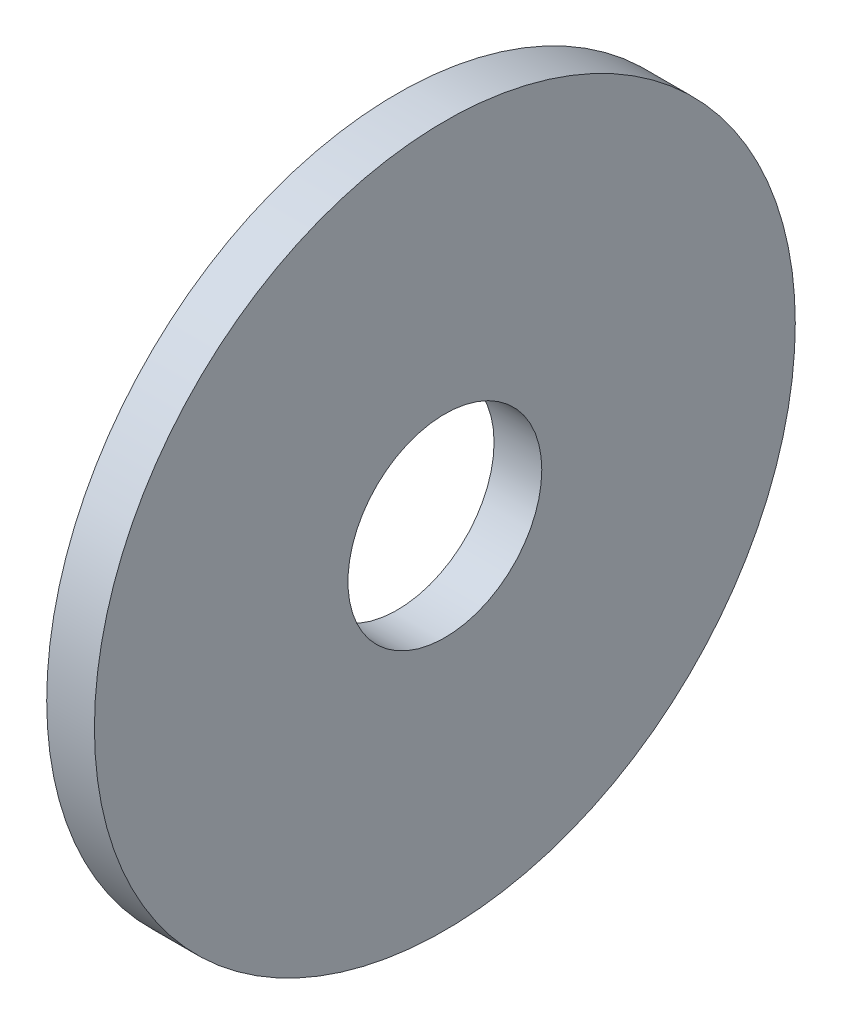
ISO-10303-21;
HEADER;
FILE_DESCRIPTION(('STEP AP214'),'2;1');
FILE_NAME('part.step','',(''),(''),'','','');
FILE_SCHEMA(('AUTOMOTIVE_DESIGN { 1 0 10303 214 1 1 1 1 }'));
ENDSEC;
DATA;
#1=APPLICATION_CONTEXT('core data for automotive mechanical design processes');
#2=APPLICATION_PROTOCOL_DEFINITION('international standard','automotive_design',2000,#1);
#3=PRODUCT_CONTEXT('',#1,'mechanical');
#4=PRODUCT('Part','Part','',(#3));
#5=PRODUCT_RELATED_PRODUCT_CATEGORY('part','',(#4));
#6=PRODUCT_DEFINITION_FORMATION('','',#4);
#7=PRODUCT_DEFINITION_CONTEXT('part definition',#1,'design');
#8=PRODUCT_DEFINITION('design','',#6,#7);
#9=PRODUCT_DEFINITION_SHAPE('','',#8);
#10=(LENGTH_UNIT() NAMED_UNIT(*) SI_UNIT(.MILLI.,.METRE.));
#11=(NAMED_UNIT(*) PLANE_ANGLE_UNIT() SI_UNIT($,.RADIAN.));
#12=(NAMED_UNIT(*) SI_UNIT($,.STERADIAN.) SOLID_ANGLE_UNIT());
#13=UNCERTAINTY_MEASURE_WITH_UNIT(LENGTH_MEASURE(1.E-05),#10,'distance_accuracy_value','');
#14=(GEOMETRIC_REPRESENTATION_CONTEXT(3) GLOBAL_UNCERTAINTY_ASSIGNED_CONTEXT((#13)) GLOBAL_UNIT_ASSIGNED_CONTEXT((#10,
#11,#12)) REPRESENTATION_CONTEXT('',''));
#15=CARTESIAN_POINT('',(0.,0.,0.));
#16=DIRECTION('',(0.,0.,1.));
#17=DIRECTION('',(1.,0.,0.));
#18=AXIS2_PLACEMENT_3D('',#15,#16,#17);
#19=CARTESIAN_POINT('',(1.27,0.,0.));
#20=DIRECTION('',(1.,0.,0.));
#21=DIRECTION('',(0.,0.,-1.));
#22=AXIS2_PLACEMENT_3D('',#19,#20,#21);
#23=PLANE('',#22);
#24=CARTESIAN_POINT('',(1.27,0.,0.));
#25=DIRECTION('',(1.,0.,0.));
#26=DIRECTION('',(0.,0.,-1.));
#27=AXIS2_PLACEMENT_3D('',#24,#25,#26);
#28=CIRCLE('',#27,9.3265625);
#29=CARTESIAN_POINT('',(1.27,0.,-9.3265625));
#30=VERTEX_POINT('',#29);
#31=EDGE_CURVE('E10',#30,#30,#28,.T.);
#32=ORIENTED_EDGE('',*,*,#31,.T.);
#33=EDGE_LOOP('',(#32));
#34=FACE_BOUND('',#33,.T.);
#35=CARTESIAN_POINT('',(1.27,0.,0.));
#36=DIRECTION('',(1.,0.,0.));
#37=DIRECTION('',(0.,0.,-1.));
#38=AXIS2_PLACEMENT_3D('',#35,#36,#37);
#39=CIRCLE('',#38,2.5796875);
#40=CARTESIAN_POINT('',(1.27,0.,-2.5796875));
#41=VERTEX_POINT('',#40);
#42=EDGE_CURVE('E42',#41,#41,#39,.T.);
#43=ORIENTED_EDGE('',*,*,#42,.F.);
#44=EDGE_LOOP('',(#43));
#45=FACE_BOUND('',#44,.T.);
#46=ADVANCED_FACE('F31',(#34,#45),#23,.T.);
#47=CARTESIAN_POINT('',(0.,0.,0.));
#48=DIRECTION('',(1.,0.,0.));
#49=DIRECTION('',(0.,0.,-1.));
#50=AXIS2_PLACEMENT_3D('',#47,#48,#49);
#51=PLANE('',#50);
#52=CARTESIAN_POINT('',(0.,0.,0.));
#53=DIRECTION('',(1.,0.,0.));
#54=DIRECTION('',(0.,0.,-1.));
#55=AXIS2_PLACEMENT_3D('',#52,#53,#54);
#56=CIRCLE('',#55,9.3265625);
#57=CARTESIAN_POINT('',(0.,0.,-9.3265625));
#58=VERTEX_POINT('',#57);
#59=EDGE_CURVE('E35',#58,#58,#56,.T.);
#60=ORIENTED_EDGE('',*,*,#59,.F.);
#61=EDGE_LOOP('',(#60));
#62=FACE_BOUND('',#61,.T.);
#63=CARTESIAN_POINT('',(0.,0.,0.));
#64=DIRECTION('',(1.,0.,0.));
#65=DIRECTION('',(0.,0.,-1.));
#66=AXIS2_PLACEMENT_3D('',#63,#64,#65);
#67=CIRCLE('',#66,2.5796875);
#68=CARTESIAN_POINT('',(0.,0.,-2.5796875));
#69=VERTEX_POINT('',#68);
#70=EDGE_CURVE('E44',#69,#69,#67,.T.);
#71=ORIENTED_EDGE('',*,*,#70,.T.);
#72=EDGE_LOOP('',(#71));
#73=FACE_BOUND('',#72,.T.);
#74=ADVANCED_FACE('F54',(#62,#73),#51,.F.);
#75=CARTESIAN_POINT('',(1.27,0.,0.));
#76=DIRECTION('',(-1.,0.,0.));
#77=DIRECTION('',(0.,0.,1.));
#78=AXIS2_PLACEMENT_3D('',#75,#76,#77);
#79=CYLINDRICAL_SURFACE('',#78,9.3265625);
#80=ORIENTED_EDGE('',*,*,#31,.F.);
#81=EDGE_LOOP('',(#80));
#82=FACE_BOUND('',#81,.T.);
#83=ORIENTED_EDGE('',*,*,#59,.T.);
#84=EDGE_LOOP('',(#83));
#85=FACE_BOUND('',#84,.T.);
#86=ADVANCED_FACE('F33',(#82,#85),#79,.T.);
#87=CARTESIAN_POINT('',(1.27,0.,0.));
#88=DIRECTION('',(-1.,0.,0.));
#89=DIRECTION('',(0.,0.,1.));
#90=AXIS2_PLACEMENT_3D('',#87,#88,#89);
#91=CYLINDRICAL_SURFACE('',#90,2.5796875);
#92=ORIENTED_EDGE('',*,*,#42,.T.);
#93=EDGE_LOOP('',(#92));
#94=FACE_BOUND('',#93,.T.);
#95=ORIENTED_EDGE('',*,*,#70,.F.);
#96=EDGE_LOOP('',(#95));
#97=FACE_BOUND('',#96,.T.);
#98=ADVANCED_FACE('F50',(#94,#97),#91,.F.);
#99=CLOSED_SHELL('',(#46,#74,#86,#98));
#100=MANIFOLD_SOLID_BREP('B2',#99);
#101=ADVANCED_BREP_SHAPE_REPRESENTATION('',(#18,#100),#14);
#102=SHAPE_DEFINITION_REPRESENTATION(#9,#101);
ENDSEC;
END-ISO-10303-21;
